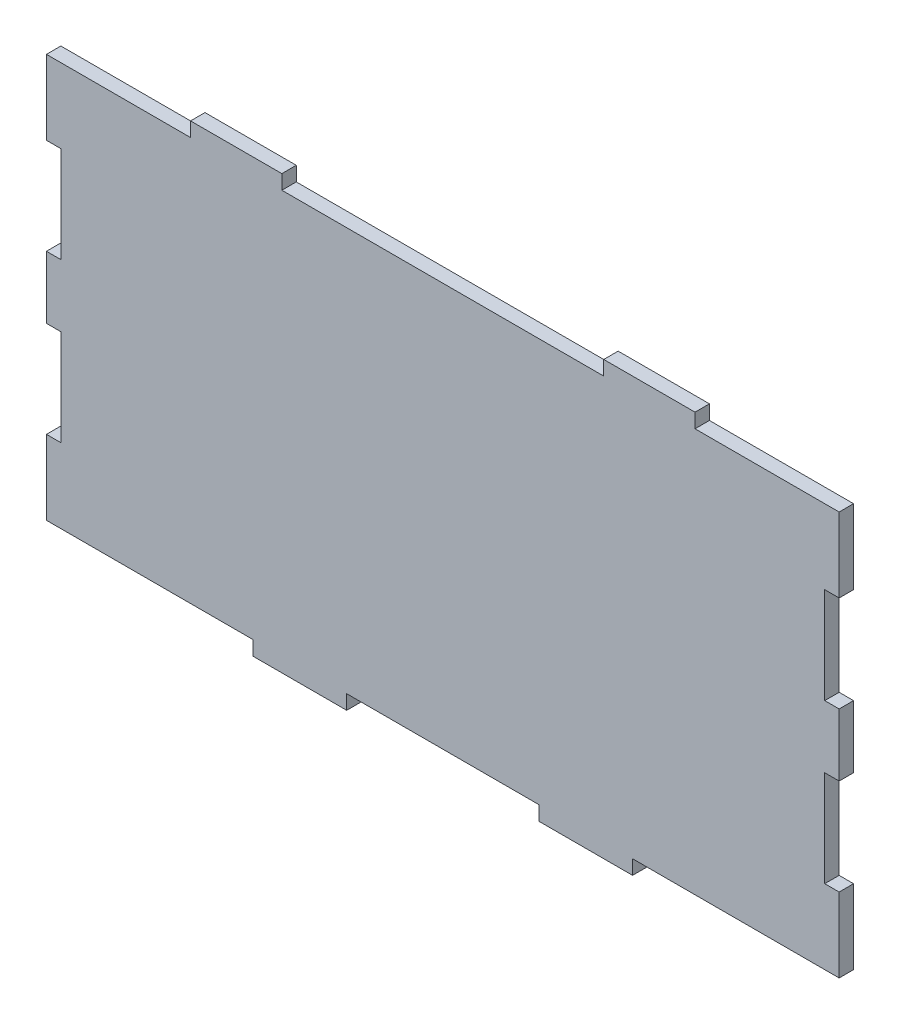
ISO-10303-21;
HEADER;
FILE_DESCRIPTION(('STEP AP214'),'2;1');
FILE_NAME('part.step','',(''),(''),'','','');
FILE_SCHEMA(('AUTOMOTIVE_DESIGN { 1 0 10303 214 1 1 1 1 }'));
ENDSEC;
DATA;
#1=APPLICATION_CONTEXT('core data for automotive mechanical design processes');
#2=APPLICATION_PROTOCOL_DEFINITION('international standard','automotive_design',2000,#1);
#3=PRODUCT_CONTEXT('',#1,'mechanical');
#4=PRODUCT('Part','Part','',(#3));
#5=PRODUCT_RELATED_PRODUCT_CATEGORY('part','',(#4));
#6=PRODUCT_DEFINITION_FORMATION('','',#4);
#7=PRODUCT_DEFINITION_CONTEXT('part definition',#1,'design');
#8=PRODUCT_DEFINITION('design','',#6,#7);
#9=PRODUCT_DEFINITION_SHAPE('','',#8);
#10=(LENGTH_UNIT() NAMED_UNIT(*) SI_UNIT(.MILLI.,.METRE.));
#11=(NAMED_UNIT(*) PLANE_ANGLE_UNIT() SI_UNIT($,.RADIAN.));
#12=(NAMED_UNIT(*) SI_UNIT($,.STERADIAN.) SOLID_ANGLE_UNIT());
#13=UNCERTAINTY_MEASURE_WITH_UNIT(LENGTH_MEASURE(1.E-05),#10,'distance_accuracy_value','');
#14=(GEOMETRIC_REPRESENTATION_CONTEXT(3) GLOBAL_UNCERTAINTY_ASSIGNED_CONTEXT((#13)) GLOBAL_UNIT_ASSIGNED_CONTEXT((#10,
#11,#12)) REPRESENTATION_CONTEXT('',''));
#15=CARTESIAN_POINT('',(0.,0.,0.));
#16=DIRECTION('',(0.,0.,1.));
#17=DIRECTION('',(1.,0.,0.));
#18=AXIS2_PLACEMENT_3D('',#15,#16,#17);
#19=CARTESIAN_POINT('',(0.,0.,6.));
#20=DIRECTION('',(0.,1.,0.));
#21=DIRECTION('',(-1.,0.,0.));
#22=AXIS2_PLACEMENT_3D('',#19,#20,#21);
#23=PLANE('',#22);
#24=DIRECTION('',(1.,0.,0.));
#25=VECTOR('',#24,1.);
#26=CARTESIAN_POINT('',(0.,0.,0.));
#27=LINE('',#26,#25);
#28=CARTESIAN_POINT('',(-244.,0.,0.));
#29=VERTEX_POINT('',#28);
#30=CARTESIAN_POINT('',(-205.,0.,0.));
#31=VERTEX_POINT('',#30);
#32=EDGE_CURVE('E37',#29,#31,#27,.T.);
#33=ORIENTED_EDGE('',*,*,#32,.T.);
#34=DIRECTION('',(0.,0.,1.));
#35=VECTOR('',#34,1.);
#36=CARTESIAN_POINT('',(-205.,0.,0.));
#37=LINE('',#36,#35);
#38=CARTESIAN_POINT('',(-205.,0.,6.));
#39=VERTEX_POINT('',#38);
#40=EDGE_CURVE('E516',#31,#39,#37,.T.);
#41=ORIENTED_EDGE('',*,*,#40,.T.);
#42=DIRECTION('',(1.,0.,0.));
#43=VECTOR('',#42,1.);
#44=CARTESIAN_POINT('',(0.,0.,6.));
#45=LINE('',#44,#43);
#46=CARTESIAN_POINT('',(-244.,0.,6.));
#47=VERTEX_POINT('',#46);
#48=EDGE_CURVE('E11',#47,#39,#45,.T.);
#49=ORIENTED_EDGE('',*,*,#48,.F.);
#50=DIRECTION('',(0.,0.,1.));
#51=VECTOR('',#50,1.);
#52=CARTESIAN_POINT('',(-244.,0.,0.));
#53=LINE('',#52,#51);
#54=EDGE_CURVE('E499',#29,#47,#53,.T.);
#55=ORIENTED_EDGE('',*,*,#54,.F.);
#56=EDGE_LOOP('',(#33,#41,#49,#55));
#57=FACE_BOUND('',#56,.T.);
#58=ADVANCED_FACE('F33',(#57),#23,.F.);
#59=CARTESIAN_POINT('',(0.,0.,6.));
#60=DIRECTION('',(-1.,0.,0.));
#61=DIRECTION('',(0.,-1.,0.));
#62=AXIS2_PLACEMENT_3D('',#59,#60,#61);
#63=PLANE('',#62);
#64=DIRECTION('',(0.,1.,0.));
#65=VECTOR('',#64,1.);
#66=CARTESIAN_POINT('',(0.,0.,6.));
#67=LINE('',#66,#65);
#68=CARTESIAN_POINT('',(0.,6.00000000000002,6.));
#69=VERTEX_POINT('',#68);
#70=CARTESIAN_POINT('',(0.,37.,6.));
#71=VERTEX_POINT('',#70);
#72=EDGE_CURVE('E326',#69,#71,#67,.T.);
#73=ORIENTED_EDGE('',*,*,#72,.F.);
#74=DIRECTION('',(0.,0.,1.));
#75=VECTOR('',#74,1.);
#76=CARTESIAN_POINT('',(0.,6.00000000000002,0.));
#77=LINE('',#76,#75);
#78=CARTESIAN_POINT('',(0.,6.00000000000002,0.));
#79=VERTEX_POINT('',#78);
#80=EDGE_CURVE('E274',#79,#69,#77,.T.);
#81=ORIENTED_EDGE('',*,*,#80,.F.);
#82=DIRECTION('',(0.,1.,0.));
#83=VECTOR('',#82,1.);
#84=CARTESIAN_POINT('',(0.,0.,0.));
#85=LINE('',#84,#83);
#86=CARTESIAN_POINT('',(0.,37.,0.));
#87=VERTEX_POINT('',#86);
#88=EDGE_CURVE('E313',#79,#87,#85,.T.);
#89=ORIENTED_EDGE('',*,*,#88,.T.);
#90=DIRECTION('',(0.,0.,1.));
#91=VECTOR('',#90,1.);
#92=CARTESIAN_POINT('',(0.,37.,0.));
#93=LINE('',#92,#91);
#94=EDGE_CURVE('E464',#87,#71,#93,.T.);
#95=ORIENTED_EDGE('',*,*,#94,.T.);
#96=EDGE_LOOP('',(#73,#81,#89,#95));
#97=FACE_BOUND('',#96,.T.);
#98=ADVANCED_FACE('F603',(#97),#63,.F.);
#99=CARTESIAN_POINT('',(0.,77.,6.));
#100=VERTEX_POINT('',#99);
#101=CARTESIAN_POINT('',(0.,103.,6.));
#102=VERTEX_POINT('',#101);
#103=EDGE_CURVE('E328',#100,#102,#67,.T.);
#104=ORIENTED_EDGE('',*,*,#103,.F.);
#105=DIRECTION('',(0.,0.,1.));
#106=VECTOR('',#105,1.);
#107=CARTESIAN_POINT('',(0.,77.,0.));
#108=LINE('',#107,#106);
#109=CARTESIAN_POINT('',(0.,77.,0.));
#110=VERTEX_POINT('',#109);
#111=EDGE_CURVE('E472',#110,#100,#108,.T.);
#112=ORIENTED_EDGE('',*,*,#111,.F.);
#113=CARTESIAN_POINT('',(0.,103.,0.));
#114=VERTEX_POINT('',#113);
#115=EDGE_CURVE('E315',#110,#114,#85,.T.);
#116=ORIENTED_EDGE('',*,*,#115,.T.);
#117=DIRECTION('',(0.,0.,1.));
#118=VECTOR('',#117,1.);
#119=CARTESIAN_POINT('',(0.,103.,0.));
#120=LINE('',#119,#118);
#121=EDGE_CURVE('E437',#114,#102,#120,.T.);
#122=ORIENTED_EDGE('',*,*,#121,.T.);
#123=EDGE_LOOP('',(#104,#112,#116,#122));
#124=FACE_BOUND('',#123,.T.);
#125=ADVANCED_FACE('F608',(#124),#63,.F.);
#126=CARTESIAN_POINT('',(-330.,0.,6.));
#127=DIRECTION('',(1.,0.,0.));
#128=DIRECTION('',(0.,0.,-1.));
#129=AXIS2_PLACEMENT_3D('',#126,#127,#128);
#130=PLANE('',#129);
#131=DIRECTION('',(0.,-1.,0.));
#132=VECTOR('',#131,1.);
#133=CARTESIAN_POINT('',(-330.,0.,0.));
#134=LINE('',#133,#132);
#135=CARTESIAN_POINT('',(-330.,103.,0.));
#136=VERTEX_POINT('',#135);
#137=CARTESIAN_POINT('',(-330.,77.,0.));
#138=VERTEX_POINT('',#137);
#139=EDGE_CURVE('E293',#136,#138,#134,.T.);
#140=ORIENTED_EDGE('',*,*,#139,.T.);
#141=DIRECTION('',(0.,0.,1.));
#142=VECTOR('',#141,1.);
#143=CARTESIAN_POINT('',(-330.,77.,0.));
#144=LINE('',#143,#142);
#145=CARTESIAN_POINT('',(-330.,77.,6.));
#146=VERTEX_POINT('',#145);
#147=EDGE_CURVE('E411',#138,#146,#144,.T.);
#148=ORIENTED_EDGE('',*,*,#147,.T.);
#149=DIRECTION('',(0.,-1.,0.));
#150=VECTOR('',#149,1.);
#151=CARTESIAN_POINT('',(-330.,0.,6.));
#152=LINE('',#151,#150);
#153=CARTESIAN_POINT('',(-330.,103.,6.));
#154=VERTEX_POINT('',#153);
#155=EDGE_CURVE('E321',#154,#146,#152,.T.);
#156=ORIENTED_EDGE('',*,*,#155,.F.);
#157=DIRECTION('',(0.,0.,1.));
#158=VECTOR('',#157,1.);
#159=CARTESIAN_POINT('',(-330.,103.,0.));
#160=LINE('',#159,#158);
#161=EDGE_CURVE('E394',#136,#154,#160,.T.);
#162=ORIENTED_EDGE('',*,*,#161,.F.);
#163=EDGE_LOOP('',(#140,#148,#156,#162));
#164=FACE_BOUND('',#163,.T.);
#165=ADVANCED_FACE('F580',(#164),#130,.F.);
#166=CARTESIAN_POINT('',(-330.,174.,0.));
#167=VERTEX_POINT('',#166);
#168=CARTESIAN_POINT('',(-330.,143.,0.));
#169=VERTEX_POINT('',#168);
#170=EDGE_CURVE('E289',#167,#169,#134,.T.);
#171=ORIENTED_EDGE('',*,*,#170,.T.);
#172=DIRECTION('',(0.,0.,1.));
#173=VECTOR('',#172,1.);
#174=CARTESIAN_POINT('',(-330.,143.,0.));
#175=LINE('',#174,#173);
#176=CARTESIAN_POINT('',(-330.,143.,6.));
#177=VERTEX_POINT('',#176);
#178=EDGE_CURVE('E389',#169,#177,#175,.T.);
#179=ORIENTED_EDGE('',*,*,#178,.T.);
#180=CARTESIAN_POINT('',(-330.,174.,6.));
#181=VERTEX_POINT('',#180);
#182=EDGE_CURVE('E318',#181,#177,#152,.T.);
#183=ORIENTED_EDGE('',*,*,#182,.F.);
#184=DIRECTION('',(0.,0.,1.));
#185=VECTOR('',#184,1.);
#186=CARTESIAN_POINT('',(-330.,174.,0.));
#187=LINE('',#186,#185);
#188=EDGE_CURVE('E329',#167,#181,#187,.T.);
#189=ORIENTED_EDGE('',*,*,#188,.F.);
#190=EDGE_LOOP('',(#171,#179,#183,#189));
#191=FACE_BOUND('',#190,.T.);
#192=ADVANCED_FACE('F619',(#191),#130,.F.);
#193=CARTESIAN_POINT('',(0.,180.,6.));
#194=DIRECTION('',(0.,-1.,0.));
#195=DIRECTION('',(1.,0.,0.));
#196=AXIS2_PLACEMENT_3D('',#193,#194,#195);
#197=PLANE('',#196);
#198=DIRECTION('',(-1.,0.,0.));
#199=VECTOR('',#198,1.);
#200=CARTESIAN_POINT('',(0.,180.,6.));
#201=LINE('',#200,#199);
#202=CARTESIAN_POINT('',(-232.,180.,6.));
#203=VERTEX_POINT('',#202);
#204=CARTESIAN_POINT('',(-270.,180.,6.));
#205=VERTEX_POINT('',#204);
#206=EDGE_CURVE('E325',#203,#205,#201,.T.);
#207=ORIENTED_EDGE('',*,*,#206,.F.);
#208=DIRECTION('',(0.,0.,1.));
#209=VECTOR('',#208,1.);
#210=CARTESIAN_POINT('',(-232.,180.,0.));
#211=LINE('',#210,#209);
#212=CARTESIAN_POINT('',(-232.,180.,0.));
#213=VERTEX_POINT('',#212);
#214=EDGE_CURVE('E344',#213,#203,#211,.T.);
#215=ORIENTED_EDGE('',*,*,#214,.F.);
#216=DIRECTION('',(-1.,0.,0.));
#217=VECTOR('',#216,1.);
#218=CARTESIAN_POINT('',(0.,180.,0.));
#219=LINE('',#218,#217);
#220=CARTESIAN_POINT('',(-270.,180.,0.));
#221=VERTEX_POINT('',#220);
#222=EDGE_CURVE('E307',#213,#221,#219,.T.);
#223=ORIENTED_EDGE('',*,*,#222,.T.);
#224=DIRECTION('',(0.,0.,1.));
#225=VECTOR('',#224,1.);
#226=CARTESIAN_POINT('',(-270.,180.,0.));
#227=LINE('',#226,#225);
#228=EDGE_CURVE('E334',#221,#205,#227,.T.);
#229=ORIENTED_EDGE('',*,*,#228,.T.);
#230=EDGE_LOOP('',(#207,#215,#223,#229));
#231=FACE_BOUND('',#230,.T.);
#232=ADVANCED_FACE('F623',(#231),#197,.F.);
#233=CARTESIAN_POINT('',(0.,143.,6.));
#234=VERTEX_POINT('',#233);
#235=CARTESIAN_POINT('',(0.,174.,6.));
#236=VERTEX_POINT('',#235);
#237=EDGE_CURVE('E291',#234,#236,#67,.T.);
#238=ORIENTED_EDGE('',*,*,#237,.F.);
#239=DIRECTION('',(0.,0.,1.));
#240=VECTOR('',#239,1.);
#241=CARTESIAN_POINT('',(0.,143.,0.));
#242=LINE('',#241,#240);
#243=CARTESIAN_POINT('',(0.,143.,0.));
#244=VERTEX_POINT('',#243);
#245=EDGE_CURVE('E445',#244,#234,#242,.T.);
#246=ORIENTED_EDGE('',*,*,#245,.F.);
#247=CARTESIAN_POINT('',(0.,174.,0.));
#248=VERTEX_POINT('',#247);
#249=EDGE_CURVE('E316',#244,#248,#85,.T.);
#250=ORIENTED_EDGE('',*,*,#249,.T.);
#251=DIRECTION('',(0.,0.,1.));
#252=VECTOR('',#251,1.);
#253=CARTESIAN_POINT('',(0.,174.,0.));
#254=LINE('',#253,#252);
#255=EDGE_CURVE('E367',#248,#236,#254,.T.);
#256=ORIENTED_EDGE('',*,*,#255,.T.);
#257=EDGE_LOOP('',(#238,#246,#250,#256));
#258=FACE_BOUND('',#257,.T.);
#259=ADVANCED_FACE('F35',(#258),#63,.F.);
#260=CARTESIAN_POINT('',(-60.,180.,6.));
#261=VERTEX_POINT('',#260);
#262=CARTESIAN_POINT('',(-98.,180.,6.));
#263=VERTEX_POINT('',#262);
#264=EDGE_CURVE('E323',#261,#263,#201,.T.);
#265=ORIENTED_EDGE('',*,*,#264,.F.);
#266=DIRECTION('',(0.,0.,1.));
#267=VECTOR('',#266,1.);
#268=CARTESIAN_POINT('',(-60.,180.,0.));
#269=LINE('',#268,#267);
#270=CARTESIAN_POINT('',(-60.,180.,0.));
#271=VERTEX_POINT('',#270);
#272=EDGE_CURVE('E375',#271,#261,#269,.T.);
#273=ORIENTED_EDGE('',*,*,#272,.F.);
#274=CARTESIAN_POINT('',(-98.,180.,0.));
#275=VERTEX_POINT('',#274);
#276=EDGE_CURVE('E302',#271,#275,#219,.T.);
#277=ORIENTED_EDGE('',*,*,#276,.T.);
#278=DIRECTION('',(0.,0.,1.));
#279=VECTOR('',#278,1.);
#280=CARTESIAN_POINT('',(-98.,180.,0.));
#281=LINE('',#280,#279);
#282=EDGE_CURVE('E354',#275,#263,#281,.T.);
#283=ORIENTED_EDGE('',*,*,#282,.T.);
#284=EDGE_LOOP('',(#265,#273,#277,#283));
#285=FACE_BOUND('',#284,.T.);
#286=ADVANCED_FACE('F618',(#285),#197,.F.);
#287=CARTESIAN_POINT('',(-330.,37.,0.));
#288=VERTEX_POINT('',#287);
#289=CARTESIAN_POINT('',(-330.,6.,0.));
#290=VERTEX_POINT('',#289);
#291=EDGE_CURVE('E294',#288,#290,#134,.T.);
#292=ORIENTED_EDGE('',*,*,#291,.T.);
#293=DIRECTION('',(0.,0.,1.));
#294=VECTOR('',#293,1.);
#295=CARTESIAN_POINT('',(-330.,6.,0.));
#296=LINE('',#295,#294);
#297=CARTESIAN_POINT('',(-330.,6.,6.));
#298=VERTEX_POINT('',#297);
#299=EDGE_CURVE('E491',#290,#298,#296,.T.);
#300=ORIENTED_EDGE('',*,*,#299,.T.);
#301=CARTESIAN_POINT('',(-330.,37.,6.));
#302=VERTEX_POINT('',#301);
#303=EDGE_CURVE('E322',#302,#298,#152,.T.);
#304=ORIENTED_EDGE('',*,*,#303,.F.);
#305=DIRECTION('',(0.,0.,1.));
#306=VECTOR('',#305,1.);
#307=CARTESIAN_POINT('',(-330.,37.,0.));
#308=LINE('',#307,#306);
#309=EDGE_CURVE('E419',#288,#302,#308,.T.);
#310=ORIENTED_EDGE('',*,*,#309,.F.);
#311=EDGE_LOOP('',(#292,#300,#304,#310));
#312=FACE_BOUND('',#311,.T.);
#313=ADVANCED_FACE('F571',(#312),#130,.F.);
#314=CARTESIAN_POINT('',(-125.,0.,0.));
#315=VERTEX_POINT('',#314);
#316=CARTESIAN_POINT('',(-86.,0.,0.));
#317=VERTEX_POINT('',#316);
#318=EDGE_CURVE('E282',#315,#317,#27,.T.);
#319=ORIENTED_EDGE('',*,*,#318,.T.);
#320=DIRECTION('',(0.,0.,1.));
#321=VECTOR('',#320,1.);
#322=CARTESIAN_POINT('',(-86.,0.,0.));
#323=LINE('',#322,#321);
#324=CARTESIAN_POINT('',(-86.,0.,6.));
#325=VERTEX_POINT('',#324);
#326=EDGE_CURVE('E266',#317,#325,#323,.T.);
#327=ORIENTED_EDGE('',*,*,#326,.T.);
#328=CARTESIAN_POINT('',(-125.,0.,6.));
#329=VERTEX_POINT('',#328);
#330=EDGE_CURVE('E42',#329,#325,#45,.T.);
#331=ORIENTED_EDGE('',*,*,#330,.F.);
#332=DIRECTION('',(0.,0.,1.));
#333=VECTOR('',#332,1.);
#334=CARTESIAN_POINT('',(-125.,0.,0.));
#335=LINE('',#334,#333);
#336=EDGE_CURVE('E288',#315,#329,#335,.T.);
#337=ORIENTED_EDGE('',*,*,#336,.F.);
#338=EDGE_LOOP('',(#319,#327,#331,#337));
#339=FACE_BOUND('',#338,.T.);
#340=ADVANCED_FACE('F287',(#339),#23,.F.);
#341=CARTESIAN_POINT('',(0.,0.,6.));
#342=DIRECTION('',(0.,0.,1.));
#343=DIRECTION('',(1.,0.,0.));
#344=AXIS2_PLACEMENT_3D('',#341,#342,#343);
#345=PLANE('',#344);
#346=DIRECTION('',(0.,-1.,0.));
#347=VECTOR('',#346,1.);
#348=CARTESIAN_POINT('',(-86.,6.,6.));
#349=LINE('',#348,#347);
#350=CARTESIAN_POINT('',(-86.,6.,6.));
#351=VERTEX_POINT('',#350);
#352=EDGE_CURVE('E269',#351,#325,#349,.T.);
#353=ORIENTED_EDGE('',*,*,#352,.F.);
#354=DIRECTION('',(-1.,0.,0.));
#355=VECTOR('',#354,1.);
#356=CARTESIAN_POINT('',(-86.,6.,6.));
#357=LINE('',#356,#355);
#358=EDGE_CURVE('E284',#69,#351,#357,.T.);
#359=ORIENTED_EDGE('',*,*,#358,.F.);
#360=ORIENTED_EDGE('',*,*,#72,.T.);
#361=DIRECTION('',(1.,0.,0.));
#362=VECTOR('',#361,1.);
#363=CARTESIAN_POINT('',(0.,37.,6.));
#364=LINE('',#363,#362);
#365=CARTESIAN_POINT('',(-5.99999999999999,37.,6.));
#366=VERTEX_POINT('',#365);
#367=EDGE_CURVE('E481',#366,#71,#364,.T.);
#368=ORIENTED_EDGE('',*,*,#367,.F.);
#369=DIRECTION('',(0.,-1.,0.));
#370=VECTOR('',#369,1.);
#371=CARTESIAN_POINT('',(-6.,77.,6.));
#372=LINE('',#371,#370);
#373=CARTESIAN_POINT('',(-6.,77.,6.));
#374=VERTEX_POINT('',#373);
#375=EDGE_CURVE('E485',#374,#366,#372,.T.);
#376=ORIENTED_EDGE('',*,*,#375,.F.);
#377=DIRECTION('',(-1.,0.,0.));
#378=VECTOR('',#377,1.);
#379=CARTESIAN_POINT('',(0.,77.,6.));
#380=LINE('',#379,#378);
#381=EDGE_CURVE('E488',#100,#374,#380,.T.);
#382=ORIENTED_EDGE('',*,*,#381,.F.);
#383=ORIENTED_EDGE('',*,*,#103,.T.);
#384=DIRECTION('',(1.,0.,0.));
#385=VECTOR('',#384,1.);
#386=CARTESIAN_POINT('',(0.,103.,6.));
#387=LINE('',#386,#385);
#388=CARTESIAN_POINT('',(-5.99999999999999,103.,6.));
#389=VERTEX_POINT('',#388);
#390=EDGE_CURVE('E454',#389,#102,#387,.T.);
#391=ORIENTED_EDGE('',*,*,#390,.F.);
#392=DIRECTION('',(0.,-1.,0.));
#393=VECTOR('',#392,1.);
#394=CARTESIAN_POINT('',(-6.,143.,6.));
#395=LINE('',#394,#393);
#396=CARTESIAN_POINT('',(-6.,143.,6.));
#397=VERTEX_POINT('',#396);
#398=EDGE_CURVE('E458',#397,#389,#395,.T.);
#399=ORIENTED_EDGE('',*,*,#398,.F.);
#400=DIRECTION('',(-1.,0.,0.));
#401=VECTOR('',#400,1.);
#402=CARTESIAN_POINT('',(0.,143.,6.));
#403=LINE('',#402,#401);
#404=EDGE_CURVE('E461',#234,#397,#403,.T.);
#405=ORIENTED_EDGE('',*,*,#404,.F.);
#406=ORIENTED_EDGE('',*,*,#237,.T.);
#407=DIRECTION('',(1.,0.,0.));
#408=VECTOR('',#407,1.);
#409=CARTESIAN_POINT('',(0.,174.,6.));
#410=LINE('',#409,#408);
#411=CARTESIAN_POINT('',(-60.,174.,6.));
#412=VERTEX_POINT('',#411);
#413=EDGE_CURVE('E382',#412,#236,#410,.T.);
#414=ORIENTED_EDGE('',*,*,#413,.F.);
#415=DIRECTION('',(0.,-1.,0.));
#416=VECTOR('',#415,1.);
#417=CARTESIAN_POINT('',(-60.,180.,6.));
#418=LINE('',#417,#416);
#419=EDGE_CURVE('E386',#261,#412,#418,.T.);
#420=ORIENTED_EDGE('',*,*,#419,.F.);
#421=ORIENTED_EDGE('',*,*,#264,.T.);
#422=DIRECTION('',(0.,1.,0.));
#423=VECTOR('',#422,1.);
#424=CARTESIAN_POINT('',(-98.,180.,6.));
#425=LINE('',#424,#423);
#426=CARTESIAN_POINT('',(-98.,174.,6.));
#427=VERTEX_POINT('',#426);
#428=EDGE_CURVE('E357',#427,#263,#425,.T.);
#429=ORIENTED_EDGE('',*,*,#428,.F.);
#430=DIRECTION('',(1.,0.,0.));
#431=VECTOR('',#430,1.);
#432=CARTESIAN_POINT('',(-232.,174.,6.));
#433=LINE('',#432,#431);
#434=CARTESIAN_POINT('',(-232.,174.,6.));
#435=VERTEX_POINT('',#434);
#436=EDGE_CURVE('E361',#435,#427,#433,.T.);
#437=ORIENTED_EDGE('',*,*,#436,.F.);
#438=DIRECTION('',(0.,-1.,0.));
#439=VECTOR('',#438,1.);
#440=CARTESIAN_POINT('',(-232.,180.,6.));
#441=LINE('',#440,#439);
#442=EDGE_CURVE('E364',#203,#435,#441,.T.);
#443=ORIENTED_EDGE('',*,*,#442,.F.);
#444=ORIENTED_EDGE('',*,*,#206,.T.);
#445=DIRECTION('',(0.,1.,0.));
#446=VECTOR('',#445,1.);
#447=CARTESIAN_POINT('',(-270.,180.,6.));
#448=LINE('',#447,#446);
#449=CARTESIAN_POINT('',(-270.,174.,6.));
#450=VERTEX_POINT('',#449);
#451=EDGE_CURVE('E337',#450,#205,#448,.T.);
#452=ORIENTED_EDGE('',*,*,#451,.F.);
#453=DIRECTION('',(1.,0.,0.));
#454=VECTOR('',#453,1.);
#455=CARTESIAN_POINT('',(-330.,174.,6.));
#456=LINE('',#455,#454);
#457=EDGE_CURVE('E341',#181,#450,#456,.T.);
#458=ORIENTED_EDGE('',*,*,#457,.F.);
#459=ORIENTED_EDGE('',*,*,#182,.T.);
#460=DIRECTION('',(-1.,0.,0.));
#461=VECTOR('',#460,1.);
#462=CARTESIAN_POINT('',(-330.,143.,6.));
#463=LINE('',#462,#461);
#464=CARTESIAN_POINT('',(-324.,143.,6.));
#465=VERTEX_POINT('',#464);
#466=EDGE_CURVE('E402',#465,#177,#463,.T.);
#467=ORIENTED_EDGE('',*,*,#466,.F.);
#468=DIRECTION('',(0.,1.,0.));
#469=VECTOR('',#468,1.);
#470=CARTESIAN_POINT('',(-324.,143.,6.));
#471=LINE('',#470,#469);
#472=CARTESIAN_POINT('',(-324.,103.,6.));
#473=VERTEX_POINT('',#472);
#474=EDGE_CURVE('E405',#473,#465,#471,.T.);
#475=ORIENTED_EDGE('',*,*,#474,.F.);
#476=DIRECTION('',(1.,0.,0.));
#477=VECTOR('',#476,1.);
#478=CARTESIAN_POINT('',(-330.,103.,6.));
#479=LINE('',#478,#477);
#480=EDGE_CURVE('E408',#154,#473,#479,.T.);
#481=ORIENTED_EDGE('',*,*,#480,.F.);
#482=ORIENTED_EDGE('',*,*,#155,.T.);
#483=DIRECTION('',(-1.,0.,0.));
#484=VECTOR('',#483,1.);
#485=CARTESIAN_POINT('',(-330.,77.,6.));
#486=LINE('',#485,#484);
#487=CARTESIAN_POINT('',(-324.,77.,6.));
#488=VERTEX_POINT('',#487);
#489=EDGE_CURVE('E428',#488,#146,#486,.T.);
#490=ORIENTED_EDGE('',*,*,#489,.F.);
#491=DIRECTION('',(0.,1.,0.));
#492=VECTOR('',#491,1.);
#493=CARTESIAN_POINT('',(-324.,37.,6.));
#494=LINE('',#493,#492);
#495=CARTESIAN_POINT('',(-324.,37.,6.));
#496=VERTEX_POINT('',#495);
#497=EDGE_CURVE('E431',#496,#488,#494,.T.);
#498=ORIENTED_EDGE('',*,*,#497,.F.);
#499=DIRECTION('',(1.,0.,0.));
#500=VECTOR('',#499,1.);
#501=CARTESIAN_POINT('',(-330.,37.,6.));
#502=LINE('',#501,#500);
#503=EDGE_CURVE('E434',#302,#496,#502,.T.);
#504=ORIENTED_EDGE('',*,*,#503,.F.);
#505=ORIENTED_EDGE('',*,*,#303,.T.);
#506=DIRECTION('',(-1.,0.,0.));
#507=VECTOR('',#506,1.);
#508=CARTESIAN_POINT('',(-330.,6.,6.));
#509=LINE('',#508,#507);
#510=CARTESIAN_POINT('',(-244.,6.,6.));
#511=VERTEX_POINT('',#510);
#512=EDGE_CURVE('E505',#511,#298,#509,.T.);
#513=ORIENTED_EDGE('',*,*,#512,.F.);
#514=DIRECTION('',(0.,1.,0.));
#515=VECTOR('',#514,1.);
#516=CARTESIAN_POINT('',(-244.,0.,6.));
#517=LINE('',#516,#515);
#518=EDGE_CURVE('E508',#47,#511,#517,.T.);
#519=ORIENTED_EDGE('',*,*,#518,.F.);
#520=ORIENTED_EDGE('',*,*,#48,.T.);
#521=DIRECTION('',(0.,-1.,0.));
#522=VECTOR('',#521,1.);
#523=CARTESIAN_POINT('',(-205.,5.99999999999995,6.));
#524=LINE('',#523,#522);
#525=CARTESIAN_POINT('',(-205.,5.99999999999995,6.));
#526=VERTEX_POINT('',#525);
#527=EDGE_CURVE('E530',#526,#39,#524,.T.);
#528=ORIENTED_EDGE('',*,*,#527,.F.);
#529=DIRECTION('',(-1.,0.,0.));
#530=VECTOR('',#529,1.);
#531=CARTESIAN_POINT('',(-205.,5.99999999999995,6.));
#532=LINE('',#531,#530);
#533=CARTESIAN_POINT('',(-125.,5.99999999999995,6.));
#534=VERTEX_POINT('',#533);
#535=EDGE_CURVE('E523',#534,#526,#532,.T.);
#536=ORIENTED_EDGE('',*,*,#535,.F.);
#537=DIRECTION('',(0.,1.,0.));
#538=VECTOR('',#537,1.);
#539=CARTESIAN_POINT('',(-125.,5.99999999999995,6.));
#540=LINE('',#539,#538);
#541=EDGE_CURVE('E527',#329,#534,#540,.T.);
#542=ORIENTED_EDGE('',*,*,#541,.F.);
#543=ORIENTED_EDGE('',*,*,#330,.T.);
#544=EDGE_LOOP('',(#353,#359,#360,#368,#376,#382,#383,#391,#399,#405,#406,#414,#420,#421,#429,
#437,#443,#444,#452,#458,#459,#467,#475,#481,#482,#490,#498,#504,#505,#513,#519,#520,#528,#536,
#542,#543));
#545=FACE_BOUND('',#544,.T.);
#546=ADVANCED_FACE('F549',(#545),#345,.T.);
#547=CARTESIAN_POINT('',(0.,0.,0.));
#548=DIRECTION('',(0.,0.,1.));
#549=DIRECTION('',(1.,0.,0.));
#550=AXIS2_PLACEMENT_3D('',#547,#548,#549);
#551=PLANE('',#550);
#552=DIRECTION('',(-1.,0.,0.));
#553=VECTOR('',#552,1.);
#554=CARTESIAN_POINT('',(-86.,6.,0.));
#555=LINE('',#554,#553);
#556=CARTESIAN_POINT('',(-86.,6.,0.));
#557=VERTEX_POINT('',#556);
#558=EDGE_CURVE('E275',#79,#557,#555,.T.);
#559=ORIENTED_EDGE('',*,*,#558,.T.);
#560=DIRECTION('',(0.,-1.,0.));
#561=VECTOR('',#560,1.);
#562=CARTESIAN_POINT('',(-86.,6.,0.));
#563=LINE('',#562,#561);
#564=EDGE_CURVE('E50',#557,#317,#563,.T.);
#565=ORIENTED_EDGE('',*,*,#564,.T.);
#566=ORIENTED_EDGE('',*,*,#318,.F.);
#567=DIRECTION('',(0.,1.,0.));
#568=VECTOR('',#567,1.);
#569=CARTESIAN_POINT('',(-125.,5.99999999999995,0.));
#570=LINE('',#569,#568);
#571=CARTESIAN_POINT('',(-125.,5.99999999999995,0.));
#572=VERTEX_POINT('',#571);
#573=EDGE_CURVE('E534',#315,#572,#570,.T.);
#574=ORIENTED_EDGE('',*,*,#573,.T.);
#575=DIRECTION('',(-1.,0.,0.));
#576=VECTOR('',#575,1.);
#577=CARTESIAN_POINT('',(-205.,5.99999999999995,0.));
#578=LINE('',#577,#576);
#579=CARTESIAN_POINT('',(-205.,5.99999999999995,0.));
#580=VERTEX_POINT('',#579);
#581=EDGE_CURVE('E58',#572,#580,#578,.T.);
#582=ORIENTED_EDGE('',*,*,#581,.T.);
#583=DIRECTION('',(0.,-1.,0.));
#584=VECTOR('',#583,1.);
#585=CARTESIAN_POINT('',(-205.,5.99999999999995,0.));
#586=LINE('',#585,#584);
#587=EDGE_CURVE('E526',#580,#31,#586,.T.);
#588=ORIENTED_EDGE('',*,*,#587,.T.);
#589=ORIENTED_EDGE('',*,*,#32,.F.);
#590=DIRECTION('',(0.,1.,0.));
#591=VECTOR('',#590,1.);
#592=CARTESIAN_POINT('',(-244.,0.,0.));
#593=LINE('',#592,#591);
#594=CARTESIAN_POINT('',(-244.,6.,0.));
#595=VERTEX_POINT('',#594);
#596=EDGE_CURVE('E507',#29,#595,#593,.T.);
#597=ORIENTED_EDGE('',*,*,#596,.T.);
#598=DIRECTION('',(-1.,0.,0.));
#599=VECTOR('',#598,1.);
#600=CARTESIAN_POINT('',(-330.,6.,0.));
#601=LINE('',#600,#599);
#602=EDGE_CURVE('E502',#595,#290,#601,.T.);
#603=ORIENTED_EDGE('',*,*,#602,.T.);
#604=ORIENTED_EDGE('',*,*,#291,.F.);
#605=DIRECTION('',(1.,0.,0.));
#606=VECTOR('',#605,1.);
#607=CARTESIAN_POINT('',(-330.,37.,0.));
#608=LINE('',#607,#606);
#609=CARTESIAN_POINT('',(-324.,37.,0.));
#610=VERTEX_POINT('',#609);
#611=EDGE_CURVE('E430',#288,#610,#608,.T.);
#612=ORIENTED_EDGE('',*,*,#611,.T.);
#613=DIRECTION('',(0.,1.,0.));
#614=VECTOR('',#613,1.);
#615=CARTESIAN_POINT('',(-324.,37.,0.));
#616=LINE('',#615,#614);
#617=CARTESIAN_POINT('',(-324.,77.,0.));
#618=VERTEX_POINT('',#617);
#619=EDGE_CURVE('E440',#610,#618,#616,.T.);
#620=ORIENTED_EDGE('',*,*,#619,.T.);
#621=DIRECTION('',(-1.,0.,0.));
#622=VECTOR('',#621,1.);
#623=CARTESIAN_POINT('',(-330.,77.,0.));
#624=LINE('',#623,#622);
#625=EDGE_CURVE('E422',#618,#138,#624,.T.);
#626=ORIENTED_EDGE('',*,*,#625,.T.);
#627=ORIENTED_EDGE('',*,*,#139,.F.);
#628=DIRECTION('',(1.,0.,0.));
#629=VECTOR('',#628,1.);
#630=CARTESIAN_POINT('',(-330.,103.,0.));
#631=LINE('',#630,#629);
#632=CARTESIAN_POINT('',(-324.,103.,0.));
#633=VERTEX_POINT('',#632);
#634=EDGE_CURVE('E404',#136,#633,#631,.T.);
#635=ORIENTED_EDGE('',*,*,#634,.T.);
#636=DIRECTION('',(0.,1.,0.));
#637=VECTOR('',#636,1.);
#638=CARTESIAN_POINT('',(-324.,143.,0.));
#639=LINE('',#638,#637);
#640=CARTESIAN_POINT('',(-324.,143.,0.));
#641=VERTEX_POINT('',#640);
#642=EDGE_CURVE('E414',#633,#641,#639,.T.);
#643=ORIENTED_EDGE('',*,*,#642,.T.);
#644=DIRECTION('',(-1.,0.,0.));
#645=VECTOR('',#644,1.);
#646=CARTESIAN_POINT('',(-330.,143.,0.));
#647=LINE('',#646,#645);
#648=EDGE_CURVE('E397',#641,#169,#647,.T.);
#649=ORIENTED_EDGE('',*,*,#648,.T.);
#650=ORIENTED_EDGE('',*,*,#170,.F.);
#651=DIRECTION('',(1.,0.,0.));
#652=VECTOR('',#651,1.);
#653=CARTESIAN_POINT('',(-330.,174.,0.));
#654=LINE('',#653,#652);
#655=CARTESIAN_POINT('',(-270.,174.,0.));
#656=VERTEX_POINT('',#655);
#657=EDGE_CURVE('E340',#167,#656,#654,.T.);
#658=ORIENTED_EDGE('',*,*,#657,.T.);
#659=DIRECTION('',(0.,1.,0.));
#660=VECTOR('',#659,1.);
#661=CARTESIAN_POINT('',(-270.,180.,0.));
#662=LINE('',#661,#660);
#663=EDGE_CURVE('E332',#656,#221,#662,.T.);
#664=ORIENTED_EDGE('',*,*,#663,.T.);
#665=ORIENTED_EDGE('',*,*,#222,.F.);
#666=DIRECTION('',(0.,-1.,0.));
#667=VECTOR('',#666,1.);
#668=CARTESIAN_POINT('',(-232.,180.,0.));
#669=LINE('',#668,#667);
#670=CARTESIAN_POINT('',(-232.,174.,0.));
#671=VERTEX_POINT('',#670);
#672=EDGE_CURVE('E360',#213,#671,#669,.T.);
#673=ORIENTED_EDGE('',*,*,#672,.T.);
#674=DIRECTION('',(1.,0.,0.));
#675=VECTOR('',#674,1.);
#676=CARTESIAN_POINT('',(-232.,174.,0.));
#677=LINE('',#676,#675);
#678=CARTESIAN_POINT('',(-98.,174.,0.));
#679=VERTEX_POINT('',#678);
#680=EDGE_CURVE('E370',#671,#679,#677,.T.);
#681=ORIENTED_EDGE('',*,*,#680,.T.);
#682=DIRECTION('',(0.,1.,0.));
#683=VECTOR('',#682,1.);
#684=CARTESIAN_POINT('',(-98.,180.,0.));
#685=LINE('',#684,#683);
#686=EDGE_CURVE('E352',#679,#275,#685,.T.);
#687=ORIENTED_EDGE('',*,*,#686,.T.);
#688=ORIENTED_EDGE('',*,*,#276,.F.);
#689=DIRECTION('',(0.,-1.,0.));
#690=VECTOR('',#689,1.);
#691=CARTESIAN_POINT('',(-60.,180.,0.));
#692=LINE('',#691,#690);
#693=CARTESIAN_POINT('',(-60.,174.,0.));
#694=VERTEX_POINT('',#693);
#695=EDGE_CURVE('E385',#271,#694,#692,.T.);
#696=ORIENTED_EDGE('',*,*,#695,.T.);
#697=DIRECTION('',(1.,0.,0.));
#698=VECTOR('',#697,1.);
#699=CARTESIAN_POINT('',(0.,174.,0.));
#700=LINE('',#699,#698);
#701=EDGE_CURVE('E378',#694,#248,#700,.T.);
#702=ORIENTED_EDGE('',*,*,#701,.T.);
#703=ORIENTED_EDGE('',*,*,#249,.F.);
#704=DIRECTION('',(-1.,0.,0.));
#705=VECTOR('',#704,1.);
#706=CARTESIAN_POINT('',(0.,143.,0.));
#707=LINE('',#706,#705);
#708=CARTESIAN_POINT('',(-6.,143.,0.));
#709=VERTEX_POINT('',#708);
#710=EDGE_CURVE('E457',#244,#709,#707,.T.);
#711=ORIENTED_EDGE('',*,*,#710,.T.);
#712=DIRECTION('',(0.,-1.,0.));
#713=VECTOR('',#712,1.);
#714=CARTESIAN_POINT('',(-6.,143.,0.));
#715=LINE('',#714,#713);
#716=CARTESIAN_POINT('',(-5.99999999999999,103.,0.));
#717=VERTEX_POINT('',#716);
#718=EDGE_CURVE('E467',#709,#717,#715,.T.);
#719=ORIENTED_EDGE('',*,*,#718,.T.);
#720=DIRECTION('',(1.,0.,0.));
#721=VECTOR('',#720,1.);
#722=CARTESIAN_POINT('',(0.,103.,0.));
#723=LINE('',#722,#721);
#724=EDGE_CURVE('E448',#717,#114,#723,.T.);
#725=ORIENTED_EDGE('',*,*,#724,.T.);
#726=ORIENTED_EDGE('',*,*,#115,.F.);
#727=DIRECTION('',(-1.,0.,0.));
#728=VECTOR('',#727,1.);
#729=CARTESIAN_POINT('',(0.,77.,0.));
#730=LINE('',#729,#728);
#731=CARTESIAN_POINT('',(-6.,77.,0.));
#732=VERTEX_POINT('',#731);
#733=EDGE_CURVE('E484',#110,#732,#730,.T.);
#734=ORIENTED_EDGE('',*,*,#733,.T.);
#735=DIRECTION('',(0.,-1.,0.));
#736=VECTOR('',#735,1.);
#737=CARTESIAN_POINT('',(-6.,77.,0.));
#738=LINE('',#737,#736);
#739=CARTESIAN_POINT('',(-5.99999999999999,37.,0.));
#740=VERTEX_POINT('',#739);
#741=EDGE_CURVE('E494',#732,#740,#738,.T.);
#742=ORIENTED_EDGE('',*,*,#741,.T.);
#743=DIRECTION('',(1.,0.,0.));
#744=VECTOR('',#743,1.);
#745=CARTESIAN_POINT('',(0.,37.,0.));
#746=LINE('',#745,#744);
#747=EDGE_CURVE('E475',#740,#87,#746,.T.);
#748=ORIENTED_EDGE('',*,*,#747,.T.);
#749=ORIENTED_EDGE('',*,*,#88,.F.);
#750=EDGE_LOOP('',(#559,#565,#566,#574,#582,#588,#589,#597,#603,#604,#612,#620,#626,#627,#635,
#643,#649,#650,#658,#664,#665,#673,#681,#687,#688,#696,#702,#703,#711,#719,#725,#726,#734,#742,
#748,#749));
#751=FACE_BOUND('',#750,.T.);
#752=ADVANCED_FACE('F280',(#751),#551,.F.);
#753=CARTESIAN_POINT('',(-270.,180.,0.));
#754=DIRECTION('',(1.,0.,0.));
#755=DIRECTION('',(0.,0.,-1.));
#756=AXIS2_PLACEMENT_3D('',#753,#754,#755);
#757=PLANE('',#756);
#758=ORIENTED_EDGE('',*,*,#451,.T.);
#759=ORIENTED_EDGE('',*,*,#228,.F.);
#760=ORIENTED_EDGE('',*,*,#663,.F.);
#761=DIRECTION('',(0.,0.,1.));
#762=VECTOR('',#761,1.);
#763=CARTESIAN_POINT('',(-270.,174.,0.));
#764=LINE('',#763,#762);
#765=EDGE_CURVE('E331',#656,#450,#764,.T.);
#766=ORIENTED_EDGE('',*,*,#765,.T.);
#767=EDGE_LOOP('',(#758,#759,#760,#766));
#768=FACE_BOUND('',#767,.T.);
#769=ADVANCED_FACE('F643',(#768),#757,.F.);
#770=CARTESIAN_POINT('',(-330.,174.,0.));
#771=DIRECTION('',(0.,-1.,0.));
#772=DIRECTION('',(0.,0.,-1.));
#773=AXIS2_PLACEMENT_3D('',#770,#771,#772);
#774=PLANE('',#773);
#775=ORIENTED_EDGE('',*,*,#457,.T.);
#776=ORIENTED_EDGE('',*,*,#765,.F.);
#777=ORIENTED_EDGE('',*,*,#657,.F.);
#778=ORIENTED_EDGE('',*,*,#188,.T.);
#779=EDGE_LOOP('',(#775,#776,#777,#778));
#780=FACE_BOUND('',#779,.T.);
#781=ADVANCED_FACE('F646',(#780),#774,.F.);
#782=CARTESIAN_POINT('',(-232.,180.,0.));
#783=DIRECTION('',(-1.,0.,0.));
#784=DIRECTION('',(0.,-1.,0.));
#785=AXIS2_PLACEMENT_3D('',#782,#783,#784);
#786=PLANE('',#785);
#787=ORIENTED_EDGE('',*,*,#442,.T.);
#788=DIRECTION('',(0.,0.,1.));
#789=VECTOR('',#788,1.);
#790=CARTESIAN_POINT('',(-232.,174.,0.));
#791=LINE('',#790,#789);
#792=EDGE_CURVE('E349',#671,#435,#791,.T.);
#793=ORIENTED_EDGE('',*,*,#792,.F.);
#794=ORIENTED_EDGE('',*,*,#672,.F.);
#795=ORIENTED_EDGE('',*,*,#214,.T.);
#796=EDGE_LOOP('',(#787,#793,#794,#795));
#797=FACE_BOUND('',#796,.T.);
#798=ADVANCED_FACE('F678',(#797),#786,.F.);
#799=CARTESIAN_POINT('',(-98.,180.,0.));
#800=DIRECTION('',(1.,0.,0.));
#801=DIRECTION('',(0.,0.,-1.));
#802=AXIS2_PLACEMENT_3D('',#799,#800,#801);
#803=PLANE('',#802);
#804=ORIENTED_EDGE('',*,*,#428,.T.);
#805=ORIENTED_EDGE('',*,*,#282,.F.);
#806=ORIENTED_EDGE('',*,*,#686,.F.);
#807=DIRECTION('',(0.,0.,1.));
#808=VECTOR('',#807,1.);
#809=CARTESIAN_POINT('',(-98.,174.,0.));
#810=LINE('',#809,#808);
#811=EDGE_CURVE('E351',#679,#427,#810,.T.);
#812=ORIENTED_EDGE('',*,*,#811,.T.);
#813=EDGE_LOOP('',(#804,#805,#806,#812));
#814=FACE_BOUND('',#813,.T.);
#815=ADVANCED_FACE('F675',(#814),#803,.F.);
#816=CARTESIAN_POINT('',(-232.,174.,0.));
#817=DIRECTION('',(0.,-1.,0.));
#818=DIRECTION('',(0.,0.,-1.));
#819=AXIS2_PLACEMENT_3D('',#816,#817,#818);
#820=PLANE('',#819);
#821=ORIENTED_EDGE('',*,*,#436,.T.);
#822=ORIENTED_EDGE('',*,*,#811,.F.);
#823=ORIENTED_EDGE('',*,*,#680,.F.);
#824=ORIENTED_EDGE('',*,*,#792,.T.);
#825=EDGE_LOOP('',(#821,#822,#823,#824));
#826=FACE_BOUND('',#825,.T.);
#827=ADVANCED_FACE('F670',(#826),#820,.F.);
#828=CARTESIAN_POINT('',(0.,174.,0.));
#829=DIRECTION('',(0.,-1.,0.));
#830=DIRECTION('',(0.,0.,-1.));
#831=AXIS2_PLACEMENT_3D('',#828,#829,#830);
#832=PLANE('',#831);
#833=ORIENTED_EDGE('',*,*,#413,.T.);
#834=ORIENTED_EDGE('',*,*,#255,.F.);
#835=ORIENTED_EDGE('',*,*,#701,.F.);
#836=DIRECTION('',(0.,0.,1.));
#837=VECTOR('',#836,1.);
#838=CARTESIAN_POINT('',(-60.,174.,0.));
#839=LINE('',#838,#837);
#840=EDGE_CURVE('E377',#694,#412,#839,.T.);
#841=ORIENTED_EDGE('',*,*,#840,.T.);
#842=EDGE_LOOP('',(#833,#834,#835,#841));
#843=FACE_BOUND('',#842,.T.);
#844=ADVANCED_FACE('F666',(#843),#832,.F.);
#845=CARTESIAN_POINT('',(-60.,180.,0.));
#846=DIRECTION('',(-1.,0.,0.));
#847=DIRECTION('',(0.,0.,1.));
#848=AXIS2_PLACEMENT_3D('',#845,#846,#847);
#849=PLANE('',#848);
#850=ORIENTED_EDGE('',*,*,#419,.T.);
#851=ORIENTED_EDGE('',*,*,#840,.F.);
#852=ORIENTED_EDGE('',*,*,#695,.F.);
#853=ORIENTED_EDGE('',*,*,#272,.T.);
#854=EDGE_LOOP('',(#850,#851,#852,#853));
#855=FACE_BOUND('',#854,.T.);
#856=ADVANCED_FACE('F669',(#855),#849,.F.);
#857=CARTESIAN_POINT('',(-330.,143.,0.));
#858=DIRECTION('',(0.,1.,0.));
#859=DIRECTION('',(0.,0.,1.));
#860=AXIS2_PLACEMENT_3D('',#857,#858,#859);
#861=PLANE('',#860);
#862=ORIENTED_EDGE('',*,*,#466,.T.);
#863=ORIENTED_EDGE('',*,*,#178,.F.);
#864=ORIENTED_EDGE('',*,*,#648,.F.);
#865=DIRECTION('',(0.,0.,1.));
#866=VECTOR('',#865,1.);
#867=CARTESIAN_POINT('',(-324.,143.,0.));
#868=LINE('',#867,#866);
#869=EDGE_CURVE('E399',#641,#465,#868,.T.);
#870=ORIENTED_EDGE('',*,*,#869,.T.);
#871=EDGE_LOOP('',(#862,#863,#864,#870));
#872=FACE_BOUND('',#871,.T.);
#873=ADVANCED_FACE('F651',(#872),#861,.F.);
#874=CARTESIAN_POINT('',(-324.,143.,0.));
#875=DIRECTION('',(1.,0.,0.));
#876=DIRECTION('',(0.,0.,-1.));
#877=AXIS2_PLACEMENT_3D('',#874,#875,#876);
#878=PLANE('',#877);
#879=ORIENTED_EDGE('',*,*,#474,.T.);
#880=ORIENTED_EDGE('',*,*,#869,.F.);
#881=ORIENTED_EDGE('',*,*,#642,.F.);
#882=DIRECTION('',(0.,0.,1.));
#883=VECTOR('',#882,1.);
#884=CARTESIAN_POINT('',(-324.,103.,0.));
#885=LINE('',#884,#883);
#886=EDGE_CURVE('E396',#633,#473,#885,.T.);
#887=ORIENTED_EDGE('',*,*,#886,.T.);
#888=EDGE_LOOP('',(#879,#880,#881,#887));
#889=FACE_BOUND('',#888,.T.);
#890=ADVANCED_FACE('F654',(#889),#878,.F.);
#891=CARTESIAN_POINT('',(-330.,103.,0.));
#892=DIRECTION('',(0.,-1.,0.));
#893=DIRECTION('',(0.,0.,-1.));
#894=AXIS2_PLACEMENT_3D('',#891,#892,#893);
#895=PLANE('',#894);
#896=ORIENTED_EDGE('',*,*,#480,.T.);
#897=ORIENTED_EDGE('',*,*,#886,.F.);
#898=ORIENTED_EDGE('',*,*,#634,.F.);
#899=ORIENTED_EDGE('',*,*,#161,.T.);
#900=EDGE_LOOP('',(#896,#897,#898,#899));
#901=FACE_BOUND('',#900,.T.);
#902=ADVANCED_FACE('F656',(#901),#895,.F.);
#903=CARTESIAN_POINT('',(-330.,77.,0.));
#904=DIRECTION('',(0.,1.,0.));
#905=DIRECTION('',(0.,0.,1.));
#906=AXIS2_PLACEMENT_3D('',#903,#904,#905);
#907=PLANE('',#906);
#908=ORIENTED_EDGE('',*,*,#489,.T.);
#909=ORIENTED_EDGE('',*,*,#147,.F.);
#910=ORIENTED_EDGE('',*,*,#625,.F.);
#911=DIRECTION('',(0.,0.,1.));
#912=VECTOR('',#911,1.);
#913=CARTESIAN_POINT('',(-324.,77.,0.));
#914=LINE('',#913,#912);
#915=EDGE_CURVE('E424',#618,#488,#914,.T.);
#916=ORIENTED_EDGE('',*,*,#915,.T.);
#917=EDGE_LOOP('',(#908,#909,#910,#916));
#918=FACE_BOUND('',#917,.T.);
#919=ADVANCED_FACE('F584',(#918),#907,.F.);
#920=CARTESIAN_POINT('',(-324.,37.,0.));
#921=DIRECTION('',(1.,0.,0.));
#922=DIRECTION('',(0.,0.,-1.));
#923=AXIS2_PLACEMENT_3D('',#920,#921,#922);
#924=PLANE('',#923);
#925=ORIENTED_EDGE('',*,*,#497,.T.);
#926=ORIENTED_EDGE('',*,*,#915,.F.);
#927=ORIENTED_EDGE('',*,*,#619,.F.);
#928=DIRECTION('',(0.,0.,1.));
#929=VECTOR('',#928,1.);
#930=CARTESIAN_POINT('',(-324.,37.,0.));
#931=LINE('',#930,#929);
#932=EDGE_CURVE('E421',#610,#496,#931,.T.);
#933=ORIENTED_EDGE('',*,*,#932,.T.);
#934=EDGE_LOOP('',(#925,#926,#927,#933));
#935=FACE_BOUND('',#934,.T.);
#936=ADVANCED_FACE('F587',(#935),#924,.F.);
#937=CARTESIAN_POINT('',(-330.,37.,0.));
#938=DIRECTION('',(0.,-1.,0.));
#939=DIRECTION('',(0.,0.,-1.));
#940=AXIS2_PLACEMENT_3D('',#937,#938,#939);
#941=PLANE('',#940);
#942=ORIENTED_EDGE('',*,*,#503,.T.);
#943=ORIENTED_EDGE('',*,*,#932,.F.);
#944=ORIENTED_EDGE('',*,*,#611,.F.);
#945=ORIENTED_EDGE('',*,*,#309,.T.);
#946=EDGE_LOOP('',(#942,#943,#944,#945));
#947=FACE_BOUND('',#946,.T.);
#948=ADVANCED_FACE('F589',(#947),#941,.F.);
#949=CARTESIAN_POINT('',(0.,103.,0.));
#950=DIRECTION('',(0.,-1.,0.));
#951=DIRECTION('',(1.,0.,0.));
#952=AXIS2_PLACEMENT_3D('',#949,#950,#951);
#953=PLANE('',#952);
#954=ORIENTED_EDGE('',*,*,#390,.T.);
#955=ORIENTED_EDGE('',*,*,#121,.F.);
#956=ORIENTED_EDGE('',*,*,#724,.F.);
#957=DIRECTION('',(0.,0.,1.));
#958=VECTOR('',#957,1.);
#959=CARTESIAN_POINT('',(-5.99999999999999,103.,0.));
#960=LINE('',#959,#958);
#961=EDGE_CURVE('E450',#717,#389,#960,.T.);
#962=ORIENTED_EDGE('',*,*,#961,.T.);
#963=EDGE_LOOP('',(#954,#955,#956,#962));
#964=FACE_BOUND('',#963,.T.);
#965=ADVANCED_FACE('F591',(#964),#953,.F.);
#966=CARTESIAN_POINT('',(-6.,143.,0.));
#967=DIRECTION('',(-1.,0.,0.));
#968=DIRECTION('',(0.,-1.,0.));
#969=AXIS2_PLACEMENT_3D('',#966,#967,#968);
#970=PLANE('',#969);
#971=ORIENTED_EDGE('',*,*,#398,.T.);
#972=ORIENTED_EDGE('',*,*,#961,.F.);
#973=ORIENTED_EDGE('',*,*,#718,.F.);
#974=DIRECTION('',(0.,0.,1.));
#975=VECTOR('',#974,1.);
#976=CARTESIAN_POINT('',(-6.,143.,0.));
#977=LINE('',#976,#975);
#978=EDGE_CURVE('E447',#709,#397,#977,.T.);
#979=ORIENTED_EDGE('',*,*,#978,.T.);
#980=EDGE_LOOP('',(#971,#972,#973,#979));
#981=FACE_BOUND('',#980,.T.);
#982=ADVANCED_FACE('F597',(#981),#970,.F.);
#983=CARTESIAN_POINT('',(0.,143.,0.));
#984=DIRECTION('',(0.,1.,0.));
#985=DIRECTION('',(0.,0.,1.));
#986=AXIS2_PLACEMENT_3D('',#983,#984,#985);
#987=PLANE('',#986);
#988=ORIENTED_EDGE('',*,*,#404,.T.);
#989=ORIENTED_EDGE('',*,*,#978,.F.);
#990=ORIENTED_EDGE('',*,*,#710,.F.);
#991=ORIENTED_EDGE('',*,*,#245,.T.);
#992=EDGE_LOOP('',(#988,#989,#990,#991));
#993=FACE_BOUND('',#992,.T.);
#994=ADVANCED_FACE('F766',(#993),#987,.F.);
#995=CARTESIAN_POINT('',(0.,37.,0.));
#996=DIRECTION('',(0.,-1.,0.));
#997=DIRECTION('',(0.,0.,-1.));
#998=AXIS2_PLACEMENT_3D('',#995,#996,#997);
#999=PLANE('',#998);
#1000=ORIENTED_EDGE('',*,*,#367,.T.);
#1001=ORIENTED_EDGE('',*,*,#94,.F.);
#1002=ORIENTED_EDGE('',*,*,#747,.F.);
#1003=DIRECTION('',(0.,0.,1.));
#1004=VECTOR('',#1003,1.);
#1005=CARTESIAN_POINT('',(-5.99999999999999,37.,0.));
#1006=LINE('',#1005,#1004);
#1007=EDGE_CURVE('E477',#740,#366,#1006,.T.);
#1008=ORIENTED_EDGE('',*,*,#1007,.T.);
#1009=EDGE_LOOP('',(#1000,#1001,#1002,#1008));
#1010=FACE_BOUND('',#1009,.T.);
#1011=ADVANCED_FACE('F776',(#1010),#999,.F.);
#1012=CARTESIAN_POINT('',(-6.,77.,0.));
#1013=DIRECTION('',(-1.,0.,0.));
#1014=DIRECTION('',(0.,-1.,0.));
#1015=AXIS2_PLACEMENT_3D('',#1012,#1013,#1014);
#1016=PLANE('',#1015);
#1017=ORIENTED_EDGE('',*,*,#375,.T.);
#1018=ORIENTED_EDGE('',*,*,#1007,.F.);
#1019=ORIENTED_EDGE('',*,*,#741,.F.);
#1020=DIRECTION('',(0.,0.,1.));
#1021=VECTOR('',#1020,1.);
#1022=CARTESIAN_POINT('',(-6.,77.,0.));
#1023=LINE('',#1022,#1021);
#1024=EDGE_CURVE('E474',#732,#374,#1023,.T.);
#1025=ORIENTED_EDGE('',*,*,#1024,.T.);
#1026=EDGE_LOOP('',(#1017,#1018,#1019,#1025));
#1027=FACE_BOUND('',#1026,.T.);
#1028=ADVANCED_FACE('F786',(#1027),#1016,.F.);
#1029=CARTESIAN_POINT('',(0.,77.,0.));
#1030=DIRECTION('',(0.,1.,0.));
#1031=DIRECTION('',(-1.,0.,0.));
#1032=AXIS2_PLACEMENT_3D('',#1029,#1030,#1031);
#1033=PLANE('',#1032);
#1034=ORIENTED_EDGE('',*,*,#381,.T.);
#1035=ORIENTED_EDGE('',*,*,#1024,.F.);
#1036=ORIENTED_EDGE('',*,*,#733,.F.);
#1037=ORIENTED_EDGE('',*,*,#111,.T.);
#1038=EDGE_LOOP('',(#1034,#1035,#1036,#1037));
#1039=FACE_BOUND('',#1038,.T.);
#1040=ADVANCED_FACE('F796',(#1039),#1033,.F.);
#1041=CARTESIAN_POINT('',(-330.,6.,0.));
#1042=DIRECTION('',(0.,1.,0.));
#1043=DIRECTION('',(-1.,0.,0.));
#1044=AXIS2_PLACEMENT_3D('',#1041,#1042,#1043);
#1045=PLANE('',#1044);
#1046=ORIENTED_EDGE('',*,*,#512,.T.);
#1047=ORIENTED_EDGE('',*,*,#299,.F.);
#1048=ORIENTED_EDGE('',*,*,#602,.F.);
#1049=DIRECTION('',(0.,0.,1.));
#1050=VECTOR('',#1049,1.);
#1051=CARTESIAN_POINT('',(-244.,6.,0.));
#1052=LINE('',#1051,#1050);
#1053=EDGE_CURVE('E501',#595,#511,#1052,.T.);
#1054=ORIENTED_EDGE('',*,*,#1053,.T.);
#1055=EDGE_LOOP('',(#1046,#1047,#1048,#1054));
#1056=FACE_BOUND('',#1055,.T.);
#1057=ADVANCED_FACE('F570',(#1056),#1045,.F.);
#1058=CARTESIAN_POINT('',(-244.,0.,0.));
#1059=DIRECTION('',(1.,0.,0.));
#1060=DIRECTION('',(0.,0.,-1.));
#1061=AXIS2_PLACEMENT_3D('',#1058,#1059,#1060);
#1062=PLANE('',#1061);
#1063=ORIENTED_EDGE('',*,*,#518,.T.);
#1064=ORIENTED_EDGE('',*,*,#1053,.F.);
#1065=ORIENTED_EDGE('',*,*,#596,.F.);
#1066=ORIENTED_EDGE('',*,*,#54,.T.);
#1067=EDGE_LOOP('',(#1063,#1064,#1065,#1066));
#1068=FACE_BOUND('',#1067,.T.);
#1069=ADVANCED_FACE('F563',(#1068),#1062,.F.);
#1070=CARTESIAN_POINT('',(-205.,5.99999999999995,0.));
#1071=DIRECTION('',(-1.,0.,0.));
#1072=DIRECTION('',(0.,0.,1.));
#1073=AXIS2_PLACEMENT_3D('',#1070,#1071,#1072);
#1074=PLANE('',#1073);
#1075=ORIENTED_EDGE('',*,*,#527,.T.);
#1076=ORIENTED_EDGE('',*,*,#40,.F.);
#1077=ORIENTED_EDGE('',*,*,#587,.F.);
#1078=DIRECTION('',(0.,0.,1.));
#1079=VECTOR('',#1078,1.);
#1080=CARTESIAN_POINT('',(-205.,5.99999999999995,0.));
#1081=LINE('',#1080,#1079);
#1082=EDGE_CURVE('E511',#580,#526,#1081,.T.);
#1083=ORIENTED_EDGE('',*,*,#1082,.T.);
#1084=EDGE_LOOP('',(#1075,#1076,#1077,#1083));
#1085=FACE_BOUND('',#1084,.T.);
#1086=ADVANCED_FACE('F823',(#1085),#1074,.F.);
#1087=CARTESIAN_POINT('',(-205.,5.99999999999995,0.));
#1088=DIRECTION('',(0.,1.,0.));
#1089=DIRECTION('',(-1.,0.,0.));
#1090=AXIS2_PLACEMENT_3D('',#1087,#1088,#1089);
#1091=PLANE('',#1090);
#1092=ORIENTED_EDGE('',*,*,#535,.T.);
#1093=ORIENTED_EDGE('',*,*,#1082,.F.);
#1094=ORIENTED_EDGE('',*,*,#581,.F.);
#1095=DIRECTION('',(0.,0.,1.));
#1096=VECTOR('',#1095,1.);
#1097=CARTESIAN_POINT('',(-125.,5.99999999999995,0.));
#1098=LINE('',#1097,#1096);
#1099=EDGE_CURVE('E520',#572,#534,#1098,.T.);
#1100=ORIENTED_EDGE('',*,*,#1099,.T.);
#1101=EDGE_LOOP('',(#1092,#1093,#1094,#1100));
#1102=FACE_BOUND('',#1101,.T.);
#1103=ADVANCED_FACE('F832',(#1102),#1091,.F.);
#1104=CARTESIAN_POINT('',(-125.,5.99999999999995,0.));
#1105=DIRECTION('',(1.,0.,0.));
#1106=DIRECTION('',(0.,0.,-1.));
#1107=AXIS2_PLACEMENT_3D('',#1104,#1105,#1106);
#1108=PLANE('',#1107);
#1109=ORIENTED_EDGE('',*,*,#541,.T.);
#1110=ORIENTED_EDGE('',*,*,#1099,.F.);
#1111=ORIENTED_EDGE('',*,*,#573,.F.);
#1112=ORIENTED_EDGE('',*,*,#336,.T.);
#1113=EDGE_LOOP('',(#1109,#1110,#1111,#1112));
#1114=FACE_BOUND('',#1113,.T.);
#1115=ADVANCED_FACE('F554',(#1114),#1108,.F.);
#1116=CARTESIAN_POINT('',(-86.,6.,0.));
#1117=DIRECTION('',(-1.,0.,0.));
#1118=DIRECTION('',(0.,0.,1.));
#1119=AXIS2_PLACEMENT_3D('',#1116,#1117,#1118);
#1120=PLANE('',#1119);
#1121=ORIENTED_EDGE('',*,*,#352,.T.);
#1122=ORIENTED_EDGE('',*,*,#326,.F.);
#1123=ORIENTED_EDGE('',*,*,#564,.F.);
#1124=DIRECTION('',(0.,0.,1.));
#1125=VECTOR('',#1124,1.);
#1126=CARTESIAN_POINT('',(-86.,6.,0.));
#1127=LINE('',#1126,#1125);
#1128=EDGE_CURVE('E532',#557,#351,#1127,.T.);
#1129=ORIENTED_EDGE('',*,*,#1128,.T.);
#1130=EDGE_LOOP('',(#1121,#1122,#1123,#1129));
#1131=FACE_BOUND('',#1130,.T.);
#1132=ADVANCED_FACE('F267',(#1131),#1120,.F.);
#1133=CARTESIAN_POINT('',(-86.,6.,0.));
#1134=DIRECTION('',(0.,1.,0.));
#1135=DIRECTION('',(-1.,0.,0.));
#1136=AXIS2_PLACEMENT_3D('',#1133,#1134,#1135);
#1137=PLANE('',#1136);
#1138=ORIENTED_EDGE('',*,*,#358,.T.);
#1139=ORIENTED_EDGE('',*,*,#1128,.F.);
#1140=ORIENTED_EDGE('',*,*,#558,.F.);
#1141=ORIENTED_EDGE('',*,*,#80,.T.);
#1142=EDGE_LOOP('',(#1138,#1139,#1140,#1141));
#1143=FACE_BOUND('',#1142,.T.);
#1144=ADVANCED_FACE('F545',(#1143),#1137,.F.);
#1145=CLOSED_SHELL('',(#58,#98,#125,#165,#192,#232,#259,#286,#313,#340,#546,#752,#769,#781,#798,
#815,#827,#844,#856,#873,#890,#902,#919,#936,#948,#965,#982,#994,#1011,#1028,#1040,#1057,#1069,
#1086,#1103,#1115,#1132,#1144));
#1146=MANIFOLD_SOLID_BREP('B2',#1145);
#1147=ADVANCED_BREP_SHAPE_REPRESENTATION('',(#18,#1146),#14);
#1148=SHAPE_DEFINITION_REPRESENTATION(#9,#1147);
ENDSEC;
END-ISO-10303-21;
